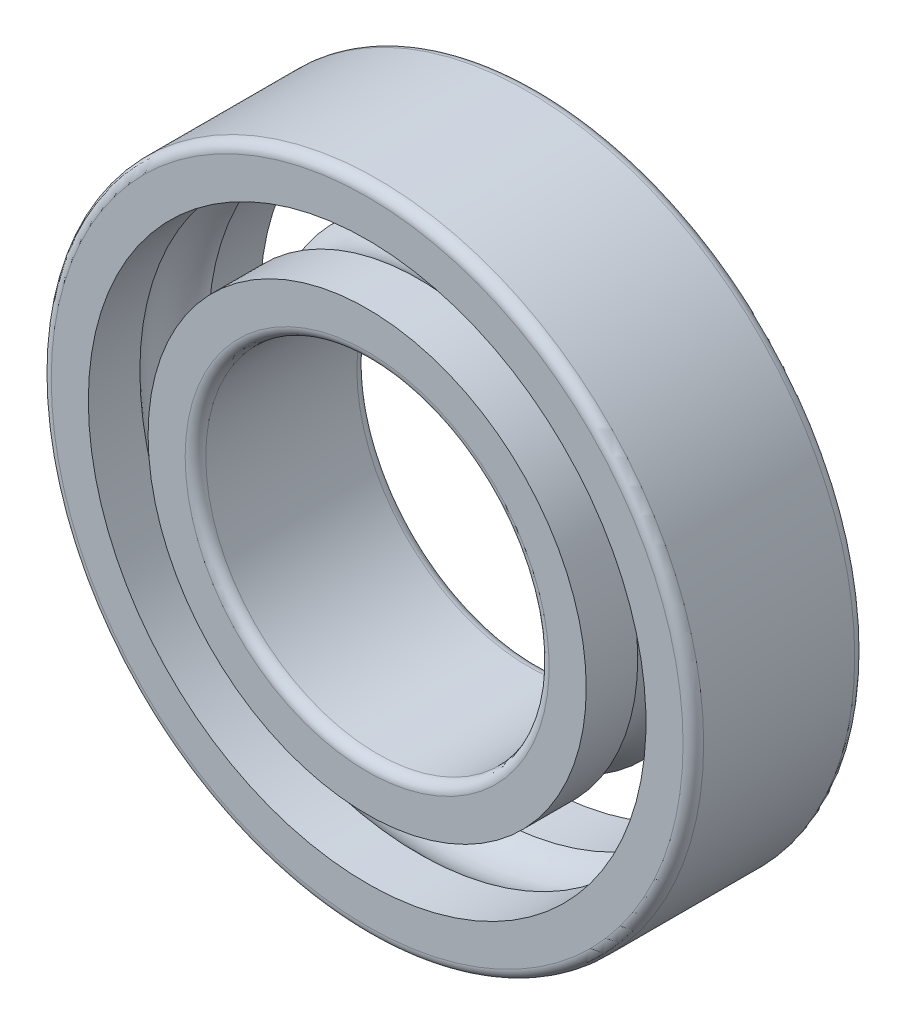
ISO-10303-21;
HEADER;
FILE_DESCRIPTION(('STEP AP214'),'2;1');
FILE_NAME('part.step','',(''),(''),'','','');
FILE_SCHEMA(('AUTOMOTIVE_DESIGN { 1 0 10303 214 1 1 1 1 }'));
ENDSEC;
DATA;
#1=APPLICATION_CONTEXT('core data for automotive mechanical design processes');
#2=APPLICATION_PROTOCOL_DEFINITION('international standard','automotive_design',2000,#1);
#3=PRODUCT_CONTEXT('',#1,'mechanical');
#4=PRODUCT('Part','Part','',(#3));
#5=PRODUCT_RELATED_PRODUCT_CATEGORY('part','',(#4));
#6=PRODUCT_DEFINITION_FORMATION('','',#4);
#7=PRODUCT_DEFINITION_CONTEXT('part definition',#1,'design');
#8=PRODUCT_DEFINITION('design','',#6,#7);
#9=PRODUCT_DEFINITION_SHAPE('','',#8);
#10=(LENGTH_UNIT() NAMED_UNIT(*) SI_UNIT(.MILLI.,.METRE.));
#11=(NAMED_UNIT(*) PLANE_ANGLE_UNIT() SI_UNIT($,.RADIAN.));
#12=(NAMED_UNIT(*) SI_UNIT($,.STERADIAN.) SOLID_ANGLE_UNIT());
#13=UNCERTAINTY_MEASURE_WITH_UNIT(LENGTH_MEASURE(1.E-05),#10,'distance_accuracy_value','');
#14=(GEOMETRIC_REPRESENTATION_CONTEXT(3) GLOBAL_UNCERTAINTY_ASSIGNED_CONTEXT((#13)) GLOBAL_UNIT_ASSIGNED_CONTEXT((#10,
#11,#12)) REPRESENTATION_CONTEXT('',''));
#15=CARTESIAN_POINT('',(0.,0.,0.));
#16=DIRECTION('',(0.,0.,1.));
#17=DIRECTION('',(1.,0.,0.));
#18=AXIS2_PLACEMENT_3D('',#15,#16,#17);
#19=CARTESIAN_POINT('',(0.,0.,-11.4860251734611));
#20=DIRECTION('',(0.,0.,-1.));
#21=DIRECTION('',(-1.,0.,0.));
#22=AXIS2_PLACEMENT_3D('',#19,#20,#21);
#23=CYLINDRICAL_SURFACE('',#22,5.);
#24=CARTESIAN_POINT('',(0.,0.,2.2));
#25=DIRECTION('',(0.,0.,-1.));
#26=DIRECTION('',(-1.,0.,0.));
#27=AXIS2_PLACEMENT_3D('',#24,#25,#26);
#28=CIRCLE('',#27,5.);
#29=CARTESIAN_POINT('',(-5.,0.,2.2));
#30=VERTEX_POINT('',#29);
#31=EDGE_CURVE('E52',#30,#30,#28,.F.);
#32=ORIENTED_EDGE('',*,*,#31,.T.);
#33=EDGE_LOOP('',(#32));
#34=FACE_BOUND('',#33,.T.);
#35=CARTESIAN_POINT('',(0.,0.,-2.2));
#36=DIRECTION('',(0.,0.,1.));
#37=DIRECTION('',(1.,0.,0.));
#38=AXIS2_PLACEMENT_3D('',#35,#36,#37);
#39=CIRCLE('',#38,5.);
#40=CARTESIAN_POINT('',(5.,0.,-2.2));
#41=VERTEX_POINT('',#40);
#42=EDGE_CURVE('E56',#41,#41,#39,.F.);
#43=ORIENTED_EDGE('',*,*,#42,.T.);
#44=EDGE_LOOP('',(#43));
#45=FACE_BOUND('',#44,.T.);
#46=ADVANCED_FACE('F45',(#34,#45),#23,.F.);
#47=CARTESIAN_POINT('',(5.,0.,2.5));
#48=DIRECTION('',(0.,0.,-1.));
#49=DIRECTION('',(-1.,0.,0.));
#50=AXIS2_PLACEMENT_3D('',#47,#48,#49);
#51=PLANE('',#50);
#52=CARTESIAN_POINT('',(0.,0.,2.5));
#53=DIRECTION('',(0.,0.,-1.));
#54=DIRECTION('',(-1.,0.,0.));
#55=AXIS2_PLACEMENT_3D('',#52,#53,#54);
#56=CIRCLE('',#55,5.3);
#57=CARTESIAN_POINT('',(-5.3,0.,2.5));
#58=VERTEX_POINT('',#57);
#59=EDGE_CURVE('E60',#58,#58,#56,.T.);
#60=ORIENTED_EDGE('',*,*,#59,.T.);
#61=EDGE_LOOP('',(#60));
#62=FACE_BOUND('',#61,.T.);
#63=CARTESIAN_POINT('',(0.,0.,2.5));
#64=DIRECTION('',(0.,0.,-1.));
#65=DIRECTION('',(-1.,0.,0.));
#66=AXIS2_PLACEMENT_3D('',#63,#64,#65);
#67=CIRCLE('',#66,6.38);
#68=CARTESIAN_POINT('',(-6.38,0.,2.5));
#69=VERTEX_POINT('',#68);
#70=EDGE_CURVE('E65',#69,#69,#67,.T.);
#71=ORIENTED_EDGE('',*,*,#70,.F.);
#72=EDGE_LOOP('',(#71));
#73=FACE_BOUND('',#72,.T.);
#74=ADVANCED_FACE('F95',(#62,#73),#51,.F.);
#75=CARTESIAN_POINT('',(0.,0.,-11.4860251734611));
#76=DIRECTION('',(0.,0.,-1.));
#77=DIRECTION('',(-1.,0.,0.));
#78=AXIS2_PLACEMENT_3D('',#75,#76,#77);
#79=CYLINDRICAL_SURFACE('',#78,6.38);
#80=CARTESIAN_POINT('',(0.,0.,0.999362296667247));
#81=DIRECTION('',(0.,0.,-1.));
#82=DIRECTION('',(-1.,0.,0.));
#83=AXIS2_PLACEMENT_3D('',#80,#81,#82);
#84=CIRCLE('',#83,6.38);
#85=CARTESIAN_POINT('',(-6.38,0.,0.999362296667247));
#86=VERTEX_POINT('',#85);
#87=EDGE_CURVE('E68',#86,#86,#84,.T.);
#88=ORIENTED_EDGE('',*,*,#87,.F.);
#89=EDGE_LOOP('',(#88));
#90=FACE_BOUND('',#89,.T.);
#91=ORIENTED_EDGE('',*,*,#70,.T.);
#92=EDGE_LOOP('',(#91));
#93=FACE_BOUND('',#92,.T.);
#94=ADVANCED_FACE('F89',(#90,#93),#79,.T.);
#95=CARTESIAN_POINT('',(0.,0.,0.));
#96=DIRECTION('',(0.,0.,-1.));
#97=DIRECTION('',(-1.,0.,0.));
#98=AXIS2_PLACEMENT_3D('',#95,#96,#97);
#99=TOROIDAL_SURFACE('',#98,7.25,1.32500000000001);
#100=CARTESIAN_POINT('',(0.,0.,-0.999362296667247));
#101=DIRECTION('',(0.,0.,-1.));
#102=DIRECTION('',(-1.,0.,0.));
#103=AXIS2_PLACEMENT_3D('',#100,#101,#102);
#104=CIRCLE('',#103,6.38);
#105=CARTESIAN_POINT('',(-6.38,0.,-0.999362296667247));
#106=VERTEX_POINT('',#105);
#107=EDGE_CURVE('E71',#106,#106,#104,.T.);
#108=ORIENTED_EDGE('',*,*,#107,.F.);
#109=EDGE_LOOP('',(#108));
#110=FACE_BOUND('',#109,.T.);
#111=ORIENTED_EDGE('',*,*,#87,.T.);
#112=EDGE_LOOP('',(#111));
#113=FACE_BOUND('',#112,.T.);
#114=ADVANCED_FACE('F83',(#110,#113),#99,.F.);
#115=CARTESIAN_POINT('',(0.,0.,-11.4860251734611));
#116=DIRECTION('',(0.,0.,-1.));
#117=DIRECTION('',(-1.,0.,0.));
#118=AXIS2_PLACEMENT_3D('',#115,#116,#117);
#119=CYLINDRICAL_SURFACE('',#118,6.38);
#120=CARTESIAN_POINT('',(0.,0.,-2.5));
#121=DIRECTION('',(0.,0.,-1.));
#122=DIRECTION('',(-1.,0.,0.));
#123=AXIS2_PLACEMENT_3D('',#120,#121,#122);
#124=CIRCLE('',#123,6.38);
#125=CARTESIAN_POINT('',(-6.38,0.,-2.5));
#126=VERTEX_POINT('',#125);
#127=EDGE_CURVE('E74',#126,#126,#124,.T.);
#128=ORIENTED_EDGE('',*,*,#127,.F.);
#129=EDGE_LOOP('',(#128));
#130=FACE_BOUND('',#129,.T.);
#131=ORIENTED_EDGE('',*,*,#107,.T.);
#132=EDGE_LOOP('',(#131));
#133=FACE_BOUND('',#132,.T.);
#134=ADVANCED_FACE('F80',(#130,#133),#119,.T.);
#135=CARTESIAN_POINT('',(5.,0.,-2.5));
#136=DIRECTION('',(0.,0.,1.));
#137=DIRECTION('',(1.,0.,0.));
#138=AXIS2_PLACEMENT_3D('',#135,#136,#137);
#139=PLANE('',#138);
#140=CARTESIAN_POINT('',(0.,0.,-2.5));
#141=DIRECTION('',(0.,0.,1.));
#142=DIRECTION('',(1.,0.,0.));
#143=AXIS2_PLACEMENT_3D('',#140,#141,#142);
#144=CIRCLE('',#143,5.3);
#145=CARTESIAN_POINT('',(5.3,0.,-2.5));
#146=VERTEX_POINT('',#145);
#147=EDGE_CURVE('E11',#146,#146,#144,.T.);
#148=ORIENTED_EDGE('',*,*,#147,.T.);
#149=EDGE_LOOP('',(#148));
#150=FACE_BOUND('',#149,.T.);
#151=ORIENTED_EDGE('',*,*,#127,.T.);
#152=EDGE_LOOP('',(#151));
#153=FACE_BOUND('',#152,.T.);
#154=ADVANCED_FACE('F78',(#150,#153),#139,.F.);
#155=CARTESIAN_POINT('',(0.,0.,2.2));
#156=DIRECTION('',(0.,0.,-1.));
#157=DIRECTION('',(-1.,0.,0.));
#158=AXIS2_PLACEMENT_3D('',#155,#156,#157);
#159=TOROIDAL_SURFACE('',#158,5.3,0.3);
#160=ORIENTED_EDGE('',*,*,#31,.F.);
#161=EDGE_LOOP('',(#160));
#162=FACE_BOUND('',#161,.T.);
#163=ORIENTED_EDGE('',*,*,#59,.F.);
#164=EDGE_LOOP('',(#163));
#165=FACE_BOUND('',#164,.T.);
#166=ADVANCED_FACE('F106',(#162,#165),#159,.T.);
#167=CARTESIAN_POINT('',(0.,0.,-2.2));
#168=DIRECTION('',(0.,0.,1.));
#169=DIRECTION('',(1.,0.,0.));
#170=AXIS2_PLACEMENT_3D('',#167,#168,#169);
#171=TOROIDAL_SURFACE('',#170,5.3,0.3);
#172=ORIENTED_EDGE('',*,*,#147,.F.);
#173=EDGE_LOOP('',(#172));
#174=FACE_BOUND('',#173,.T.);
#175=ORIENTED_EDGE('',*,*,#42,.F.);
#176=EDGE_LOOP('',(#175));
#177=FACE_BOUND('',#176,.T.);
#178=ADVANCED_FACE('F47',(#174,#177),#171,.T.);
#179=CLOSED_SHELL('',(#46,#74,#94,#114,#134,#154,#166,#178));
#180=MANIFOLD_SOLID_BREP('B2',#179);
#181=CARTESIAN_POINT('',(8.12,0.,2.5));
#182=DIRECTION('',(0.,0.,-1.));
#183=DIRECTION('',(-1.,0.,0.));
#184=AXIS2_PLACEMENT_3D('',#181,#182,#183);
#185=PLANE('',#184);
#186=CARTESIAN_POINT('',(0.,0.,2.5));
#187=DIRECTION('',(0.,0.,-1.));
#188=DIRECTION('',(-1.,0.,0.));
#189=AXIS2_PLACEMENT_3D('',#186,#187,#188);
#190=CIRCLE('',#189,9.2);
#191=CARTESIAN_POINT('',(-9.2,0.,2.5));
#192=VERTEX_POINT('',#191);
#193=EDGE_CURVE('E44',#192,#192,#190,.F.);
#194=ORIENTED_EDGE('',*,*,#193,.T.);
#195=EDGE_LOOP('',(#194));
#196=FACE_BOUND('',#195,.T.);
#197=CARTESIAN_POINT('',(0.,0.,2.5));
#198=DIRECTION('',(0.,0.,-1.));
#199=DIRECTION('',(-1.,0.,0.));
#200=AXIS2_PLACEMENT_3D('',#197,#198,#199);
#201=CIRCLE('',#200,8.12);
#202=CARTESIAN_POINT('',(-8.12,0.,2.5));
#203=VERTEX_POINT('',#202);
#204=EDGE_CURVE('E203',#203,#203,#201,.T.);
#205=ORIENTED_EDGE('',*,*,#204,.T.);
#206=EDGE_LOOP('',(#205));
#207=FACE_BOUND('',#206,.T.);
#208=ADVANCED_FACE('F167',(#196,#207),#185,.F.);
#209=CARTESIAN_POINT('',(0.,0.,-11.4860251734611));
#210=DIRECTION('',(0.,0.,-1.));
#211=DIRECTION('',(-1.,0.,0.));
#212=AXIS2_PLACEMENT_3D('',#209,#210,#211);
#213=CYLINDRICAL_SURFACE('',#212,9.5);
#214=CARTESIAN_POINT('',(0.,0.,-2.2));
#215=DIRECTION('',(0.,0.,1.));
#216=DIRECTION('',(1.,0.,0.));
#217=AXIS2_PLACEMENT_3D('',#214,#215,#216);
#218=CIRCLE('',#217,9.5);
#219=CARTESIAN_POINT('',(9.5,0.,-2.2));
#220=VERTEX_POINT('',#219);
#221=EDGE_CURVE('E175',#220,#220,#218,.T.);
#222=ORIENTED_EDGE('',*,*,#221,.T.);
#223=EDGE_LOOP('',(#222));
#224=FACE_BOUND('',#223,.T.);
#225=CARTESIAN_POINT('',(0.,0.,2.2));
#226=DIRECTION('',(0.,0.,-1.));
#227=DIRECTION('',(-1.,0.,0.));
#228=AXIS2_PLACEMENT_3D('',#225,#226,#227);
#229=CIRCLE('',#228,9.5);
#230=CARTESIAN_POINT('',(-9.5,0.,2.2));
#231=VERTEX_POINT('',#230);
#232=EDGE_CURVE('E180',#231,#231,#229,.T.);
#233=ORIENTED_EDGE('',*,*,#232,.T.);
#234=EDGE_LOOP('',(#233));
#235=FACE_BOUND('',#234,.T.);
#236=ADVANCED_FACE('F230',(#224,#235),#213,.T.);
#237=CARTESIAN_POINT('',(8.12,0.,-2.5));
#238=DIRECTION('',(0.,0.,1.));
#239=DIRECTION('',(1.,0.,0.));
#240=AXIS2_PLACEMENT_3D('',#237,#238,#239);
#241=PLANE('',#240);
#242=CARTESIAN_POINT('',(0.,0.,-2.5));
#243=DIRECTION('',(0.,0.,1.));
#244=DIRECTION('',(1.,0.,0.));
#245=AXIS2_PLACEMENT_3D('',#242,#243,#244);
#246=CIRCLE('',#245,9.2);
#247=CARTESIAN_POINT('',(9.2,0.,-2.5));
#248=VERTEX_POINT('',#247);
#249=EDGE_CURVE('E185',#248,#248,#246,.F.);
#250=ORIENTED_EDGE('',*,*,#249,.T.);
#251=EDGE_LOOP('',(#250));
#252=FACE_BOUND('',#251,.T.);
#253=CARTESIAN_POINT('',(0.,0.,-2.5));
#254=DIRECTION('',(0.,0.,-1.));
#255=DIRECTION('',(-1.,0.,0.));
#256=AXIS2_PLACEMENT_3D('',#253,#254,#255);
#257=CIRCLE('',#256,8.12);
#258=CARTESIAN_POINT('',(-8.12,0.,-2.5));
#259=VERTEX_POINT('',#258);
#260=EDGE_CURVE('E191',#259,#259,#257,.T.);
#261=ORIENTED_EDGE('',*,*,#260,.F.);
#262=EDGE_LOOP('',(#261));
#263=FACE_BOUND('',#262,.T.);
#264=ADVANCED_FACE('F225',(#252,#263),#241,.F.);
#265=CARTESIAN_POINT('',(0.,0.,-11.4860251734611));
#266=DIRECTION('',(0.,0.,-1.));
#267=DIRECTION('',(-1.,0.,0.));
#268=AXIS2_PLACEMENT_3D('',#265,#266,#267);
#269=CYLINDRICAL_SURFACE('',#268,8.12);
#270=CARTESIAN_POINT('',(0.,0.,-0.999362296667243));
#271=DIRECTION('',(0.,0.,-1.));
#272=DIRECTION('',(-1.,0.,0.));
#273=AXIS2_PLACEMENT_3D('',#270,#271,#272);
#274=CIRCLE('',#273,8.12);
#275=CARTESIAN_POINT('',(-8.12,0.,-0.999362296667243));
#276=VERTEX_POINT('',#275);
#277=EDGE_CURVE('E195',#276,#276,#274,.T.);
#278=ORIENTED_EDGE('',*,*,#277,.F.);
#279=EDGE_LOOP('',(#278));
#280=FACE_BOUND('',#279,.T.);
#281=ORIENTED_EDGE('',*,*,#260,.T.);
#282=EDGE_LOOP('',(#281));
#283=FACE_BOUND('',#282,.T.);
#284=ADVANCED_FACE('F219',(#280,#283),#269,.F.);
#285=CARTESIAN_POINT('',(0.,0.,0.));
#286=DIRECTION('',(0.,0.,-1.));
#287=DIRECTION('',(-1.,0.,0.));
#288=AXIS2_PLACEMENT_3D('',#285,#286,#287);
#289=TOROIDAL_SURFACE('',#288,7.25,1.32500000000001);
#290=CARTESIAN_POINT('',(0.,0.,0.999362296667243));
#291=DIRECTION('',(0.,0.,-1.));
#292=DIRECTION('',(-1.,0.,0.));
#293=AXIS2_PLACEMENT_3D('',#290,#291,#292);
#294=CIRCLE('',#293,8.12);
#295=CARTESIAN_POINT('',(-8.12,0.,0.999362296667243));
#296=VERTEX_POINT('',#295);
#297=EDGE_CURVE('E199',#296,#296,#294,.T.);
#298=ORIENTED_EDGE('',*,*,#297,.F.);
#299=EDGE_LOOP('',(#298));
#300=FACE_BOUND('',#299,.T.);
#301=ORIENTED_EDGE('',*,*,#277,.T.);
#302=EDGE_LOOP('',(#301));
#303=FACE_BOUND('',#302,.T.);
#304=ADVANCED_FACE('F213',(#300,#303),#289,.F.);
#305=CARTESIAN_POINT('',(0.,0.,-11.4860251734611));
#306=DIRECTION('',(0.,0.,-1.));
#307=DIRECTION('',(-1.,0.,0.));
#308=AXIS2_PLACEMENT_3D('',#305,#306,#307);
#309=CYLINDRICAL_SURFACE('',#308,8.12);
#310=ORIENTED_EDGE('',*,*,#204,.F.);
#311=EDGE_LOOP('',(#310));
#312=FACE_BOUND('',#311,.T.);
#313=ORIENTED_EDGE('',*,*,#297,.T.);
#314=EDGE_LOOP('',(#313));
#315=FACE_BOUND('',#314,.T.);
#316=ADVANCED_FACE('F209',(#312,#315),#309,.F.);
#317=CARTESIAN_POINT('',(0.,0.,-2.2));
#318=DIRECTION('',(0.,0.,1.));
#319=DIRECTION('',(1.,0.,0.));
#320=AXIS2_PLACEMENT_3D('',#317,#318,#319);
#321=TOROIDAL_SURFACE('',#320,9.2,0.3);
#322=ORIENTED_EDGE('',*,*,#221,.F.);
#323=EDGE_LOOP('',(#322));
#324=FACE_BOUND('',#323,.T.);
#325=ORIENTED_EDGE('',*,*,#249,.F.);
#326=EDGE_LOOP('',(#325));
#327=FACE_BOUND('',#326,.T.);
#328=ADVANCED_FACE('F212',(#324,#327),#321,.T.);
#329=CARTESIAN_POINT('',(0.,0.,2.2));
#330=DIRECTION('',(0.,0.,-1.));
#331=DIRECTION('',(-1.,0.,0.));
#332=AXIS2_PLACEMENT_3D('',#329,#330,#331);
#333=TOROIDAL_SURFACE('',#332,9.2,0.3);
#334=ORIENTED_EDGE('',*,*,#193,.F.);
#335=EDGE_LOOP('',(#334));
#336=FACE_BOUND('',#335,.T.);
#337=ORIENTED_EDGE('',*,*,#232,.F.);
#338=EDGE_LOOP('',(#337));
#339=FACE_BOUND('',#338,.T.);
#340=ADVANCED_FACE('F169',(#336,#339),#333,.T.);
#341=CLOSED_SHELL('',(#208,#236,#264,#284,#304,#316,#328,#340));
#342=MANIFOLD_SOLID_BREP('B6',#341);
#343=ADVANCED_BREP_SHAPE_REPRESENTATION('',(#18,#180,#342),#14);
#344=SHAPE_DEFINITION_REPRESENTATION(#9,#343);
ENDSEC;
END-ISO-10303-21;
